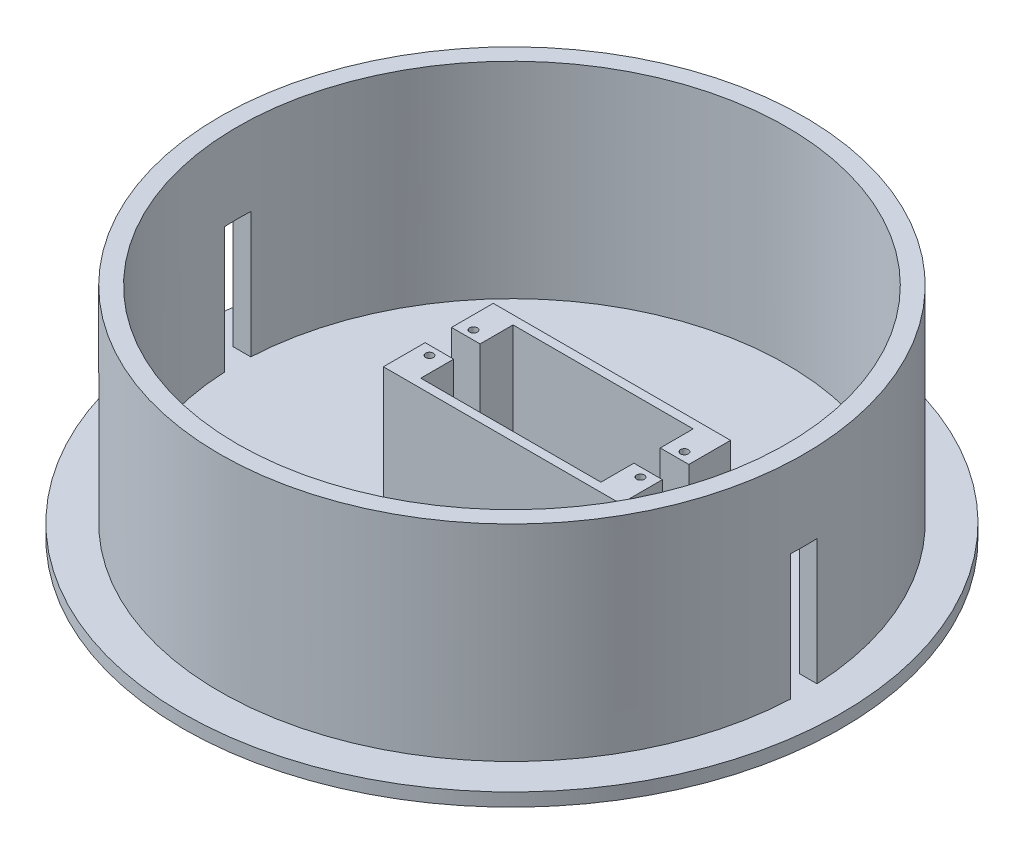
ISO-10303-21;
HEADER;
FILE_DESCRIPTION(('STEP AP214'),'2;1');
FILE_NAME('part.step','',(''),(''),'','','');
FILE_SCHEMA(('AUTOMOTIVE_DESIGN { 1 0 10303 214 1 1 1 1 }'));
ENDSEC;
DATA;
#1=APPLICATION_CONTEXT('core data for automotive mechanical design processes');
#2=APPLICATION_PROTOCOL_DEFINITION('international standard','automotive_design',2000,#1);
#3=PRODUCT_CONTEXT('',#1,'mechanical');
#4=PRODUCT('Part','Part','',(#3));
#5=PRODUCT_RELATED_PRODUCT_CATEGORY('part','',(#4));
#6=PRODUCT_DEFINITION_FORMATION('','',#4);
#7=PRODUCT_DEFINITION_CONTEXT('part definition',#1,'design');
#8=PRODUCT_DEFINITION('design','',#6,#7);
#9=PRODUCT_DEFINITION_SHAPE('','',#8);
#10=(LENGTH_UNIT() NAMED_UNIT(*) SI_UNIT(.MILLI.,.METRE.));
#11=(NAMED_UNIT(*) PLANE_ANGLE_UNIT() SI_UNIT($,.RADIAN.));
#12=(NAMED_UNIT(*) SI_UNIT($,.STERADIAN.) SOLID_ANGLE_UNIT());
#13=UNCERTAINTY_MEASURE_WITH_UNIT(LENGTH_MEASURE(1.E-05),#10,'distance_accuracy_value','');
#14=(GEOMETRIC_REPRESENTATION_CONTEXT(3) GLOBAL_UNCERTAINTY_ASSIGNED_CONTEXT((#13)) GLOBAL_UNIT_ASSIGNED_CONTEXT((#10,
#11,#12)) REPRESENTATION_CONTEXT('',''));
#15=CARTESIAN_POINT('',(0.,0.,0.));
#16=DIRECTION('',(0.,0.,1.));
#17=DIRECTION('',(1.,0.,0.));
#18=AXIS2_PLACEMENT_3D('',#15,#16,#17);
#19=CARTESIAN_POINT('',(-16.75,28.65,0.));
#20=DIRECTION('',(1.,0.,0.));
#21=DIRECTION('',(0.,0.,-1.));
#22=AXIS2_PLACEMENT_3D('',#19,#20,#21);
#23=PLANE('',#22);
#24=DIRECTION('',(0.,-1.,0.));
#25=VECTOR('',#24,1.);
#26=CARTESIAN_POINT('',(-16.75,28.65,-3.));
#27=LINE('',#26,#25);
#28=CARTESIAN_POINT('',(-16.75,28.65,-3.));
#29=VERTEX_POINT('',#28);
#30=CARTESIAN_POINT('',(-16.75,0.,-3.));
#31=VERTEX_POINT('',#30);
#32=EDGE_CURVE('E238',#29,#31,#27,.T.);
#33=ORIENTED_EDGE('',*,*,#32,.F.);
#34=DIRECTION('',(0.,0.,1.));
#35=VECTOR('',#34,1.);
#36=CARTESIAN_POINT('',(-16.75,28.65,0.));
#37=LINE('',#36,#35);
#38=CARTESIAN_POINT('',(-16.75,28.65,-12.5));
#39=VERTEX_POINT('',#38);
#40=EDGE_CURVE('E295',#39,#29,#37,.T.);
#41=ORIENTED_EDGE('',*,*,#40,.F.);
#42=DIRECTION('',(0.,-1.,0.));
#43=VECTOR('',#42,1.);
#44=CARTESIAN_POINT('',(-16.75,28.65,-12.5));
#45=LINE('',#44,#43);
#46=CARTESIAN_POINT('',(-16.75,0.,-12.5));
#47=VERTEX_POINT('',#46);
#48=EDGE_CURVE('E342',#39,#47,#45,.T.);
#49=ORIENTED_EDGE('',*,*,#48,.T.);
#50=DIRECTION('',(0.,0.,1.));
#51=VECTOR('',#50,1.);
#52=CARTESIAN_POINT('',(-16.75,0.,0.));
#53=LINE('',#52,#51);
#54=EDGE_CURVE('E323',#47,#31,#53,.T.);
#55=ORIENTED_EDGE('',*,*,#54,.T.);
#56=EDGE_LOOP('',(#33,#41,#49,#55));
#57=FACE_BOUND('',#56,.T.);
#58=ADVANCED_FACE('F41',(#57),#23,.F.);
#59=CARTESIAN_POINT('',(30.75,28.65,0.));
#60=DIRECTION('',(1.,0.,0.));
#61=DIRECTION('',(0.,0.,-1.));
#62=AXIS2_PLACEMENT_3D('',#59,#60,#61);
#63=PLANE('',#62);
#64=DIRECTION('',(0.,-1.,0.));
#65=VECTOR('',#64,1.);
#66=CARTESIAN_POINT('',(30.75,28.65,-3.00000000000001));
#67=LINE('',#66,#65);
#68=CARTESIAN_POINT('',(30.75,28.65,-3.00000000000001));
#69=VERTEX_POINT('',#68);
#70=CARTESIAN_POINT('',(30.75,0.,-3.));
#71=VERTEX_POINT('',#70);
#72=EDGE_CURVE('E450',#69,#71,#67,.T.);
#73=ORIENTED_EDGE('',*,*,#72,.F.);
#74=DIRECTION('',(0.,0.,1.));
#75=VECTOR('',#74,1.);
#76=CARTESIAN_POINT('',(30.75,28.65,0.));
#77=LINE('',#76,#75);
#78=CARTESIAN_POINT('',(30.75,28.65,-10.5));
#79=VERTEX_POINT('',#78);
#80=EDGE_CURVE('E269',#79,#69,#77,.T.);
#81=ORIENTED_EDGE('',*,*,#80,.F.);
#82=DIRECTION('',(0.,-1.,0.));
#83=VECTOR('',#82,1.);
#84=CARTESIAN_POINT('',(30.75,28.65,-10.5));
#85=LINE('',#84,#83);
#86=CARTESIAN_POINT('',(30.75,0.,-10.5));
#87=VERTEX_POINT('',#86);
#88=EDGE_CURVE('E336',#79,#87,#85,.T.);
#89=ORIENTED_EDGE('',*,*,#88,.T.);
#90=DIRECTION('',(0.,0.,1.));
#91=VECTOR('',#90,1.);
#92=CARTESIAN_POINT('',(30.75,0.,0.));
#93=LINE('',#92,#91);
#94=EDGE_CURVE('E309',#87,#71,#93,.T.);
#95=ORIENTED_EDGE('',*,*,#94,.T.);
#96=EDGE_LOOP('',(#73,#81,#89,#95));
#97=FACE_BOUND('',#96,.T.);
#98=ADVANCED_FACE('F400',(#97),#63,.F.);
#99=CARTESIAN_POINT('',(-10.25,28.65,0.));
#100=DIRECTION('',(1.,0.,0.));
#101=DIRECTION('',(0.,0.,-1.));
#102=AXIS2_PLACEMENT_3D('',#99,#100,#101);
#103=PLANE('',#102);
#104=DIRECTION('',(0.,0.,1.));
#105=VECTOR('',#104,1.);
#106=CARTESIAN_POINT('',(-10.25,28.65,0.));
#107=LINE('',#106,#105);
#108=CARTESIAN_POINT('',(-10.25,28.65,-10.5));
#109=VERTEX_POINT('',#108);
#110=CARTESIAN_POINT('',(-10.25,28.65,-3.));
#111=VERTEX_POINT('',#110);
#112=EDGE_CURVE('E276',#109,#111,#107,.T.);
#113=ORIENTED_EDGE('',*,*,#112,.T.);
#114=DIRECTION('',(0.,-1.,0.));
#115=VECTOR('',#114,1.);
#116=CARTESIAN_POINT('',(-10.25,28.65,-3.));
#117=LINE('',#116,#115);
#118=CARTESIAN_POINT('',(-10.25,0.,-3.));
#119=VERTEX_POINT('',#118);
#120=EDGE_CURVE('E447',#111,#119,#117,.T.);
#121=ORIENTED_EDGE('',*,*,#120,.T.);
#122=DIRECTION('',(0.,0.,1.));
#123=VECTOR('',#122,1.);
#124=CARTESIAN_POINT('',(-10.25,0.,0.));
#125=LINE('',#124,#123);
#126=CARTESIAN_POINT('',(-10.25,0.,-10.5));
#127=VERTEX_POINT('',#126);
#128=EDGE_CURVE('E316',#127,#119,#125,.T.);
#129=ORIENTED_EDGE('',*,*,#128,.F.);
#130=DIRECTION('',(0.,-1.,0.));
#131=VECTOR('',#130,1.);
#132=CARTESIAN_POINT('',(-10.25,28.65,-10.5));
#133=LINE('',#132,#131);
#134=EDGE_CURVE('E305',#109,#127,#133,.T.);
#135=ORIENTED_EDGE('',*,*,#134,.F.);
#136=EDGE_LOOP('',(#113,#121,#129,#135));
#137=FACE_BOUND('',#136,.T.);
#138=ADVANCED_FACE('F407',(#137),#103,.T.);
#139=CARTESIAN_POINT('',(37.25,28.65,0.));
#140=DIRECTION('',(1.,0.,0.));
#141=DIRECTION('',(0.,0.,-1.));
#142=AXIS2_PLACEMENT_3D('',#139,#140,#141);
#143=PLANE('',#142);
#144=DIRECTION('',(0.,0.,1.));
#145=VECTOR('',#144,1.);
#146=CARTESIAN_POINT('',(37.25,28.65,0.));
#147=LINE('',#146,#145);
#148=CARTESIAN_POINT('',(37.25,28.65,-12.5));
#149=VERTEX_POINT('',#148);
#150=CARTESIAN_POINT('',(37.25,28.65,-3.));
#151=VERTEX_POINT('',#150);
#152=EDGE_CURVE('E302',#149,#151,#147,.T.);
#153=ORIENTED_EDGE('',*,*,#152,.T.);
#154=DIRECTION('',(0.,-1.,0.));
#155=VECTOR('',#154,1.);
#156=CARTESIAN_POINT('',(37.25,28.65,-3.00000000000001));
#157=LINE('',#156,#155);
#158=CARTESIAN_POINT('',(37.25,0.,-3.00000000000001));
#159=VERTEX_POINT('',#158);
#160=EDGE_CURVE('E441',#151,#159,#157,.T.);
#161=ORIENTED_EDGE('',*,*,#160,.T.);
#162=DIRECTION('',(0.,0.,1.));
#163=VECTOR('',#162,1.);
#164=CARTESIAN_POINT('',(37.25,0.,0.));
#165=LINE('',#164,#163);
#166=CARTESIAN_POINT('',(37.25,0.,-12.5));
#167=VERTEX_POINT('',#166);
#168=EDGE_CURVE('E268',#167,#159,#165,.T.);
#169=ORIENTED_EDGE('',*,*,#168,.F.);
#170=DIRECTION('',(0.,-1.,0.));
#171=VECTOR('',#170,1.);
#172=CARTESIAN_POINT('',(37.25,28.65,-12.5));
#173=LINE('',#172,#171);
#174=EDGE_CURVE('E332',#149,#167,#173,.T.);
#175=ORIENTED_EDGE('',*,*,#174,.F.);
#176=EDGE_LOOP('',(#153,#161,#169,#175));
#177=FACE_BOUND('',#176,.T.);
#178=ADVANCED_FACE('F465',(#177),#143,.T.);
#179=CARTESIAN_POINT('',(0.,28.65,0.));
#180=DIRECTION('',(0.,1.,0.));
#181=DIRECTION('',(0.,0.,1.));
#182=AXIS2_PLACEMENT_3D('',#179,#180,#181);
#183=PLANE('',#182);
#184=CARTESIAN_POINT('',(34.25,28.65,-5.));
#185=DIRECTION('',(0.,1.,0.));
#186=DIRECTION('',(0.,0.,1.));
#187=AXIS2_PLACEMENT_3D('',#184,#185,#186);
#188=CIRCLE('',#187,0.874999999999998);
#189=CARTESIAN_POINT('',(34.25,28.65,-4.125));
#190=VERTEX_POINT('',#189);
#191=EDGE_CURVE('E288',#190,#190,#188,.T.);
#192=ORIENTED_EDGE('',*,*,#191,.F.);
#193=EDGE_LOOP('',(#192));
#194=FACE_BOUND('',#193,.T.);
#195=CARTESIAN_POINT('',(-13.75,28.65,-4.99999999999999));
#196=DIRECTION('',(0.,1.,0.));
#197=DIRECTION('',(0.,0.,1.));
#198=AXIS2_PLACEMENT_3D('',#195,#196,#197);
#199=CIRCLE('',#198,0.875000000000002);
#200=CARTESIAN_POINT('',(-13.75,28.65,-4.12499999999999));
#201=VERTEX_POINT('',#200);
#202=EDGE_CURVE('E285',#201,#201,#199,.T.);
#203=ORIENTED_EDGE('',*,*,#202,.F.);
#204=EDGE_LOOP('',(#203));
#205=FACE_BOUND('',#204,.T.);
#206=ORIENTED_EDGE('',*,*,#40,.T.);
#207=DIRECTION('',(1.,0.,0.));
#208=VECTOR('',#207,1.);
#209=CARTESIAN_POINT('',(-75.,28.65,-2.99999999999999));
#210=LINE('',#209,#208);
#211=EDGE_CURVE('E226',#29,#111,#210,.T.);
#212=ORIENTED_EDGE('',*,*,#211,.T.);
#213=ORIENTED_EDGE('',*,*,#112,.F.);
#214=DIRECTION('',(-1.,0.,0.));
#215=VECTOR('',#214,1.);
#216=CARTESIAN_POINT('',(0.,28.65,-10.5));
#217=LINE('',#216,#215);
#218=EDGE_CURVE('E264',#79,#109,#217,.T.);
#219=ORIENTED_EDGE('',*,*,#218,.F.);
#220=ORIENTED_EDGE('',*,*,#80,.T.);
#221=EDGE_CURVE('E470',#69,#151,#210,.T.);
#222=ORIENTED_EDGE('',*,*,#221,.T.);
#223=ORIENTED_EDGE('',*,*,#152,.F.);
#224=DIRECTION('',(-1.,0.,0.));
#225=VECTOR('',#224,1.);
#226=CARTESIAN_POINT('',(0.,28.65,-12.5));
#227=LINE('',#226,#225);
#228=EDGE_CURVE('E291',#149,#39,#227,.T.);
#229=ORIENTED_EDGE('',*,*,#228,.T.);
#230=EDGE_LOOP('',(#206,#212,#213,#219,#220,#222,#223,#229));
#231=FACE_BOUND('',#230,.T.);
#232=ADVANCED_FACE('F473',(#194,#205,#231),#183,.T.);
#233=CARTESIAN_POINT('',(0.,46.8,0.));
#234=DIRECTION('',(0.,-1.,0.));
#235=DIRECTION('',(0.,0.,-1.));
#236=AXIS2_PLACEMENT_3D('',#233,#234,#235);
#237=CYLINDRICAL_SURFACE('',#236,62.5);
#238=DIRECTION('',(0.,-1.,0.));
#239=VECTOR('',#238,1.);
#240=CARTESIAN_POINT('',(-62.4279584801554,46.8,3.));
#241=LINE('',#240,#239);
#242=CARTESIAN_POINT('',(-62.4279584801554,28.65,3.00000000000001));
#243=VERTEX_POINT('',#242);
#244=CARTESIAN_POINT('',(-62.4279584801554,0.,3.00000000000001));
#245=VERTEX_POINT('',#244);
#246=EDGE_CURVE('E216',#243,#245,#241,.T.);
#247=ORIENTED_EDGE('',*,*,#246,.F.);
#248=CARTESIAN_POINT('',(0.,28.65,0.));
#249=DIRECTION('',(0.,-1.,0.));
#250=DIRECTION('',(0.,0.,-1.));
#251=AXIS2_PLACEMENT_3D('',#248,#249,#250);
#252=CIRCLE('',#251,62.5);
#253=CARTESIAN_POINT('',(-62.4279584801554,28.65,-2.99999999999999));
#254=VERTEX_POINT('',#253);
#255=EDGE_CURVE('E261',#243,#254,#252,.T.);
#256=ORIENTED_EDGE('',*,*,#255,.T.);
#257=DIRECTION('',(0.,-1.,0.));
#258=VECTOR('',#257,1.);
#259=CARTESIAN_POINT('',(-62.4279584801554,46.8,-3.));
#260=LINE('',#259,#258);
#261=CARTESIAN_POINT('',(-62.4279584801554,0.,-2.99999999999999));
#262=VERTEX_POINT('',#261);
#263=EDGE_CURVE('E224',#254,#262,#260,.T.);
#264=ORIENTED_EDGE('',*,*,#263,.T.);
#265=CARTESIAN_POINT('',(0.,0.,0.));
#266=DIRECTION('',(0.,1.,0.));
#267=DIRECTION('',(0.,0.,1.));
#268=AXIS2_PLACEMENT_3D('',#265,#266,#267);
#269=CIRCLE('',#268,62.5);
#270=CARTESIAN_POINT('',(62.4279584801554,0.,-3.00000000000001));
#271=VERTEX_POINT('',#270);
#272=EDGE_CURVE('E369',#271,#262,#269,.T.);
#273=ORIENTED_EDGE('',*,*,#272,.F.);
#274=DIRECTION('',(0.,-1.,0.));
#275=VECTOR('',#274,1.);
#276=CARTESIAN_POINT('',(62.4279584801554,46.8,-3.00000000000001));
#277=LINE('',#276,#275);
#278=CARTESIAN_POINT('',(62.4279584801554,28.65,-3.00000000000001));
#279=VERTEX_POINT('',#278);
#280=EDGE_CURVE('E233',#271,#279,#277,.F.);
#281=ORIENTED_EDGE('',*,*,#280,.T.);
#282=CARTESIAN_POINT('',(62.4279584801554,28.65,2.99999999999999));
#283=VERTEX_POINT('',#282);
#284=EDGE_CURVE('E263',#279,#283,#252,.T.);
#285=ORIENTED_EDGE('',*,*,#284,.T.);
#286=DIRECTION('',(0.,-1.,0.));
#287=VECTOR('',#286,1.);
#288=CARTESIAN_POINT('',(62.4279584801554,46.8,2.99999999999999));
#289=LINE('',#288,#287);
#290=CARTESIAN_POINT('',(62.4279584801554,0.,2.99999999999999));
#291=VERTEX_POINT('',#290);
#292=EDGE_CURVE('E258',#291,#283,#289,.F.);
#293=ORIENTED_EDGE('',*,*,#292,.F.);
#294=EDGE_CURVE('E359',#245,#291,#269,.T.);
#295=ORIENTED_EDGE('',*,*,#294,.F.);
#296=EDGE_LOOP('',(#247,#256,#264,#273,#281,#285,#293,#295));
#297=FACE_BOUND('',#296,.T.);
#298=CARTESIAN_POINT('',(0.,46.8,0.));
#299=DIRECTION('',(0.,1.,0.));
#300=DIRECTION('',(0.,0.,1.));
#301=AXIS2_PLACEMENT_3D('',#298,#299,#300);
#302=CIRCLE('',#301,62.5);
#303=CARTESIAN_POINT('',(0.,46.8,62.5));
#304=VERTEX_POINT('',#303);
#305=EDGE_CURVE('E365',#304,#304,#302,.T.);
#306=ORIENTED_EDGE('',*,*,#305,.T.);
#307=EDGE_LOOP('',(#306));
#308=FACE_BOUND('',#307,.T.);
#309=ADVANCED_FACE('F43',(#297,#308),#237,.F.);
#310=CARTESIAN_POINT('',(0.,46.8,0.));
#311=DIRECTION('',(0.,-1.,0.));
#312=DIRECTION('',(0.,0.,-1.));
#313=AXIS2_PLACEMENT_3D('',#310,#311,#312);
#314=CYLINDRICAL_SURFACE('',#313,66.5);
#315=CARTESIAN_POINT('',(0.,28.65,0.));
#316=DIRECTION('',(0.,-1.,0.));
#317=DIRECTION('',(0.,0.,-1.));
#318=AXIS2_PLACEMENT_3D('',#315,#316,#317);
#319=CIRCLE('',#318,66.5);
#320=CARTESIAN_POINT('',(-66.4322963625374,28.65,3.00000000000001));
#321=VERTEX_POINT('',#320);
#322=CARTESIAN_POINT('',(-66.4322963625374,28.65,-2.99999999999999));
#323=VERTEX_POINT('',#322);
#324=EDGE_CURVE('E205',#321,#323,#319,.T.);
#325=ORIENTED_EDGE('',*,*,#324,.F.);
#326=DIRECTION('',(0.,-1.,0.));
#327=VECTOR('',#326,1.);
#328=CARTESIAN_POINT('',(-66.4322963625374,46.8,3.));
#329=LINE('',#328,#327);
#330=CARTESIAN_POINT('',(-66.4322963625374,0.,3.00000000000001));
#331=VERTEX_POINT('',#330);
#332=EDGE_CURVE('E256',#321,#331,#329,.T.);
#333=ORIENTED_EDGE('',*,*,#332,.T.);
#334=CARTESIAN_POINT('',(0.,0.,0.));
#335=DIRECTION('',(0.,1.,0.));
#336=DIRECTION('',(0.,0.,1.));
#337=AXIS2_PLACEMENT_3D('',#334,#335,#336);
#338=CIRCLE('',#337,66.5);
#339=CARTESIAN_POINT('',(66.4322963625374,0.,2.99999999999999));
#340=VERTEX_POINT('',#339);
#341=EDGE_CURVE('E345',#331,#340,#338,.T.);
#342=ORIENTED_EDGE('',*,*,#341,.T.);
#343=DIRECTION('',(0.,-1.,0.));
#344=VECTOR('',#343,1.);
#345=CARTESIAN_POINT('',(66.4322963625374,46.8,2.99999999999999));
#346=LINE('',#345,#344);
#347=CARTESIAN_POINT('',(66.4322963625374,28.65,2.99999999999999));
#348=VERTEX_POINT('',#347);
#349=EDGE_CURVE('E253',#340,#348,#346,.F.);
#350=ORIENTED_EDGE('',*,*,#349,.T.);
#351=CARTESIAN_POINT('',(66.4322963625374,28.65,-3.00000000000001));
#352=VERTEX_POINT('',#351);
#353=EDGE_CURVE('E215',#352,#348,#319,.T.);
#354=ORIENTED_EDGE('',*,*,#353,.F.);
#355=DIRECTION('',(0.,-1.,0.));
#356=VECTOR('',#355,1.);
#357=CARTESIAN_POINT('',(66.4322963625374,46.8,-3.00000000000001));
#358=LINE('',#357,#356);
#359=CARTESIAN_POINT('',(66.4322963625374,0.,-3.00000000000001));
#360=VERTEX_POINT('',#359);
#361=EDGE_CURVE('E234',#360,#352,#358,.F.);
#362=ORIENTED_EDGE('',*,*,#361,.F.);
#363=CARTESIAN_POINT('',(-66.4322963625374,0.,-2.99999999999999));
#364=VERTEX_POINT('',#363);
#365=EDGE_CURVE('E232',#360,#364,#338,.T.);
#366=ORIENTED_EDGE('',*,*,#365,.T.);
#367=DIRECTION('',(0.,-1.,0.));
#368=VECTOR('',#367,1.);
#369=CARTESIAN_POINT('',(-66.4322963625374,46.8,-3.));
#370=LINE('',#369,#368);
#371=EDGE_CURVE('E221',#323,#364,#370,.T.);
#372=ORIENTED_EDGE('',*,*,#371,.F.);
#373=EDGE_LOOP('',(#325,#333,#342,#350,#354,#362,#366,#372));
#374=FACE_BOUND('',#373,.T.);
#375=CARTESIAN_POINT('',(0.,46.8,0.));
#376=DIRECTION('',(0.,1.,0.));
#377=DIRECTION('',(0.,0.,1.));
#378=AXIS2_PLACEMENT_3D('',#375,#376,#377);
#379=CIRCLE('',#378,66.5);
#380=CARTESIAN_POINT('',(0.,46.8,66.5));
#381=VERTEX_POINT('',#380);
#382=EDGE_CURVE('E368',#381,#381,#379,.T.);
#383=ORIENTED_EDGE('',*,*,#382,.F.);
#384=EDGE_LOOP('',(#383));
#385=FACE_BOUND('',#384,.T.);
#386=ADVANCED_FACE('F229',(#374,#385),#314,.T.);
#387=CARTESIAN_POINT('',(0.,46.8,0.));
#388=DIRECTION('',(0.,1.,0.));
#389=DIRECTION('',(0.,0.,1.));
#390=AXIS2_PLACEMENT_3D('',#387,#388,#389);
#391=PLANE('',#390);
#392=ORIENTED_EDGE('',*,*,#305,.F.);
#393=EDGE_LOOP('',(#392));
#394=FACE_BOUND('',#393,.T.);
#395=ORIENTED_EDGE('',*,*,#382,.T.);
#396=EDGE_LOOP('',(#395));
#397=FACE_BOUND('',#396,.T.);
#398=ADVANCED_FACE('F548',(#394,#397),#391,.T.);
#399=CARTESIAN_POINT('',(0.,-3.,0.));
#400=DIRECTION('',(0.,1.,0.));
#401=DIRECTION('',(0.,0.,1.));
#402=AXIS2_PLACEMENT_3D('',#399,#400,#401);
#403=CYLINDRICAL_SURFACE('',#402,75.);
#404=CARTESIAN_POINT('',(0.,-3.,0.));
#405=DIRECTION('',(0.,1.,0.));
#406=DIRECTION('',(0.,0.,1.));
#407=AXIS2_PLACEMENT_3D('',#404,#405,#406);
#408=CIRCLE('',#407,75.);
#409=CARTESIAN_POINT('',(0.,-3.,75.));
#410=VERTEX_POINT('',#409);
#411=EDGE_CURVE('E356',#410,#410,#408,.T.);
#412=ORIENTED_EDGE('',*,*,#411,.T.);
#413=EDGE_LOOP('',(#412));
#414=FACE_BOUND('',#413,.T.);
#415=CARTESIAN_POINT('',(0.,0.,0.));
#416=DIRECTION('',(0.,1.,0.));
#417=DIRECTION('',(0.,0.,1.));
#418=AXIS2_PLACEMENT_3D('',#415,#416,#417);
#419=CIRCLE('',#418,75.);
#420=CARTESIAN_POINT('',(0.,0.,75.));
#421=VERTEX_POINT('',#420);
#422=EDGE_CURVE('E360',#421,#421,#419,.T.);
#423=ORIENTED_EDGE('',*,*,#422,.F.);
#424=EDGE_LOOP('',(#423));
#425=FACE_BOUND('',#424,.T.);
#426=ADVANCED_FACE('F546',(#414,#425),#403,.T.);
#427=CARTESIAN_POINT('',(0.,-3.,0.));
#428=DIRECTION('',(0.,1.,0.));
#429=DIRECTION('',(0.,0.,1.));
#430=AXIS2_PLACEMENT_3D('',#427,#428,#429);
#431=PLANE('',#430);
#432=ORIENTED_EDGE('',*,*,#411,.F.);
#433=EDGE_LOOP('',(#432));
#434=FACE_BOUND('',#433,.T.);
#435=ADVANCED_FACE('F424',(#434),#431,.F.);
#436=CARTESIAN_POINT('',(0.,28.65,-12.5));
#437=DIRECTION('',(0.,0.,1.));
#438=DIRECTION('',(1.,0.,0.));
#439=AXIS2_PLACEMENT_3D('',#436,#437,#438);
#440=PLANE('',#439);
#441=DIRECTION('',(-1.,0.,0.));
#442=VECTOR('',#441,1.);
#443=CARTESIAN_POINT('',(0.,0.,-12.5));
#444=LINE('',#443,#442);
#445=EDGE_CURVE('E319',#167,#47,#444,.T.);
#446=ORIENTED_EDGE('',*,*,#445,.T.);
#447=ORIENTED_EDGE('',*,*,#48,.F.);
#448=ORIENTED_EDGE('',*,*,#228,.F.);
#449=ORIENTED_EDGE('',*,*,#174,.T.);
#450=EDGE_LOOP('',(#446,#447,#448,#449));
#451=FACE_BOUND('',#450,.T.);
#452=ADVANCED_FACE('F416',(#451),#440,.F.);
#453=CARTESIAN_POINT('',(-16.75,28.65,3.));
#454=VERTEX_POINT('',#453);
#455=CARTESIAN_POINT('',(-16.75,28.65,12.5));
#456=VERTEX_POINT('',#455);
#457=EDGE_CURVE('E294',#454,#456,#37,.T.);
#458=ORIENTED_EDGE('',*,*,#457,.F.);
#459=DIRECTION('',(0.,-1.,0.));
#460=VECTOR('',#459,1.);
#461=CARTESIAN_POINT('',(-16.75,28.65,3.));
#462=LINE('',#461,#460);
#463=CARTESIAN_POINT('',(-16.75,0.,3.));
#464=VERTEX_POINT('',#463);
#465=EDGE_CURVE('E250',#454,#464,#462,.T.);
#466=ORIENTED_EDGE('',*,*,#465,.T.);
#467=CARTESIAN_POINT('',(-16.75,0.,12.5));
#468=VERTEX_POINT('',#467);
#469=EDGE_CURVE('E322',#464,#468,#53,.T.);
#470=ORIENTED_EDGE('',*,*,#469,.T.);
#471=DIRECTION('',(0.,-1.,0.));
#472=VECTOR('',#471,1.);
#473=CARTESIAN_POINT('',(-16.75,28.65,12.5));
#474=LINE('',#473,#472);
#475=EDGE_CURVE('E339',#456,#468,#474,.T.);
#476=ORIENTED_EDGE('',*,*,#475,.F.);
#477=EDGE_LOOP('',(#458,#466,#470,#476));
#478=FACE_BOUND('',#477,.T.);
#479=ADVANCED_FACE('F403',(#478),#23,.F.);
#480=CARTESIAN_POINT('',(0.,28.65,12.5));
#481=DIRECTION('',(0.,0.,1.));
#482=DIRECTION('',(1.,0.,0.));
#483=AXIS2_PLACEMENT_3D('',#480,#481,#482);
#484=PLANE('',#483);
#485=DIRECTION('',(-1.,0.,0.));
#486=VECTOR('',#485,1.);
#487=CARTESIAN_POINT('',(0.,0.,12.5));
#488=LINE('',#487,#486);
#489=CARTESIAN_POINT('',(37.25,0.,12.5));
#490=VERTEX_POINT('',#489);
#491=EDGE_CURVE('E326',#490,#468,#488,.T.);
#492=ORIENTED_EDGE('',*,*,#491,.F.);
#493=DIRECTION('',(0.,-1.,0.));
#494=VECTOR('',#493,1.);
#495=CARTESIAN_POINT('',(37.25,28.65,12.5));
#496=LINE('',#495,#494);
#497=CARTESIAN_POINT('',(37.25,28.65,12.5));
#498=VERTEX_POINT('',#497);
#499=EDGE_CURVE('E335',#498,#490,#496,.T.);
#500=ORIENTED_EDGE('',*,*,#499,.F.);
#501=DIRECTION('',(-1.,0.,0.));
#502=VECTOR('',#501,1.);
#503=CARTESIAN_POINT('',(0.,28.65,12.5));
#504=LINE('',#503,#502);
#505=EDGE_CURVE('E298',#498,#456,#504,.T.);
#506=ORIENTED_EDGE('',*,*,#505,.T.);
#507=ORIENTED_EDGE('',*,*,#475,.T.);
#508=EDGE_LOOP('',(#492,#500,#506,#507));
#509=FACE_BOUND('',#508,.T.);
#510=ADVANCED_FACE('F415',(#509),#484,.T.);
#511=CARTESIAN_POINT('',(0.,28.65,-10.5));
#512=DIRECTION('',(0.,0.,1.));
#513=DIRECTION('',(1.,0.,0.));
#514=AXIS2_PLACEMENT_3D('',#511,#512,#513);
#515=PLANE('',#514);
#516=DIRECTION('',(-1.,0.,0.));
#517=VECTOR('',#516,1.);
#518=CARTESIAN_POINT('',(0.,0.,-10.5));
#519=LINE('',#518,#517);
#520=EDGE_CURVE('E306',#87,#127,#519,.T.);
#521=ORIENTED_EDGE('',*,*,#520,.F.);
#522=ORIENTED_EDGE('',*,*,#88,.F.);
#523=ORIENTED_EDGE('',*,*,#218,.T.);
#524=ORIENTED_EDGE('',*,*,#134,.T.);
#525=EDGE_LOOP('',(#521,#522,#523,#524));
#526=FACE_BOUND('',#525,.T.);
#527=ADVANCED_FACE('F422',(#526),#515,.T.);
#528=CARTESIAN_POINT('',(30.75,28.65,2.99999999999999));
#529=VERTEX_POINT('',#528);
#530=CARTESIAN_POINT('',(30.75,28.65,10.5));
#531=VERTEX_POINT('',#530);
#532=EDGE_CURVE('E267',#529,#531,#77,.T.);
#533=ORIENTED_EDGE('',*,*,#532,.F.);
#534=DIRECTION('',(0.,-1.,0.));
#535=VECTOR('',#534,1.);
#536=CARTESIAN_POINT('',(30.75,28.65,2.99999999999999));
#537=LINE('',#536,#535);
#538=CARTESIAN_POINT('',(30.75,0.,3.));
#539=VERTEX_POINT('',#538);
#540=EDGE_CURVE('E247',#529,#539,#537,.T.);
#541=ORIENTED_EDGE('',*,*,#540,.T.);
#542=CARTESIAN_POINT('',(30.75,0.,10.5));
#543=VERTEX_POINT('',#542);
#544=EDGE_CURVE('E308',#539,#543,#93,.T.);
#545=ORIENTED_EDGE('',*,*,#544,.T.);
#546=DIRECTION('',(0.,-1.,0.));
#547=VECTOR('',#546,1.);
#548=CARTESIAN_POINT('',(30.75,28.65,10.5));
#549=LINE('',#548,#547);
#550=EDGE_CURVE('E351',#531,#543,#549,.T.);
#551=ORIENTED_EDGE('',*,*,#550,.F.);
#552=EDGE_LOOP('',(#533,#541,#545,#551));
#553=FACE_BOUND('',#552,.T.);
#554=ADVANCED_FACE('F410',(#553),#63,.F.);
#555=CARTESIAN_POINT('',(0.,28.65,10.5));
#556=DIRECTION('',(0.,0.,1.));
#557=DIRECTION('',(1.,0.,0.));
#558=AXIS2_PLACEMENT_3D('',#555,#556,#557);
#559=PLANE('',#558);
#560=DIRECTION('',(-1.,0.,0.));
#561=VECTOR('',#560,1.);
#562=CARTESIAN_POINT('',(0.,0.,10.5));
#563=LINE('',#562,#561);
#564=CARTESIAN_POINT('',(-10.25,0.,10.5));
#565=VERTEX_POINT('',#564);
#566=EDGE_CURVE('E312',#543,#565,#563,.T.);
#567=ORIENTED_EDGE('',*,*,#566,.T.);
#568=DIRECTION('',(0.,-1.,0.));
#569=VECTOR('',#568,1.);
#570=CARTESIAN_POINT('',(-10.25,28.65,10.5));
#571=LINE('',#570,#569);
#572=CARTESIAN_POINT('',(-10.25,28.65,10.5));
#573=VERTEX_POINT('',#572);
#574=EDGE_CURVE('E348',#573,#565,#571,.T.);
#575=ORIENTED_EDGE('',*,*,#574,.F.);
#576=DIRECTION('',(-1.,0.,0.));
#577=VECTOR('',#576,1.);
#578=CARTESIAN_POINT('',(0.,28.65,10.5));
#579=LINE('',#578,#577);
#580=EDGE_CURVE('E272',#531,#573,#579,.T.);
#581=ORIENTED_EDGE('',*,*,#580,.F.);
#582=ORIENTED_EDGE('',*,*,#550,.T.);
#583=EDGE_LOOP('',(#567,#575,#581,#582));
#584=FACE_BOUND('',#583,.T.);
#585=ADVANCED_FACE('F504',(#584),#559,.F.);
#586=CARTESIAN_POINT('',(34.25,28.65,-5.));
#587=DIRECTION('',(0.,-1.,0.));
#588=DIRECTION('',(0.,0.,-1.));
#589=AXIS2_PLACEMENT_3D('',#586,#587,#588);
#590=CYLINDRICAL_SURFACE('',#589,0.874999999999998);
#591=ORIENTED_EDGE('',*,*,#191,.T.);
#592=EDGE_LOOP('',(#591));
#593=FACE_BOUND('',#592,.T.);
#594=CARTESIAN_POINT('',(34.25,0.,-5.));
#595=DIRECTION('',(0.,1.,0.));
#596=DIRECTION('',(0.,0.,1.));
#597=AXIS2_PLACEMENT_3D('',#594,#595,#596);
#598=CIRCLE('',#597,0.874999999999998);
#599=CARTESIAN_POINT('',(34.25,0.,-4.125));
#600=VERTEX_POINT('',#599);
#601=EDGE_CURVE('E11',#600,#600,#598,.F.);
#602=ORIENTED_EDGE('',*,*,#601,.T.);
#603=EDGE_LOOP('',(#602));
#604=FACE_BOUND('',#603,.T.);
#605=ADVANCED_FACE('F564',(#593,#604),#590,.F.);
#606=CARTESIAN_POINT('',(-13.75,28.65,-4.99999999999999));
#607=DIRECTION('',(0.,-1.,0.));
#608=DIRECTION('',(0.,0.,-1.));
#609=AXIS2_PLACEMENT_3D('',#606,#607,#608);
#610=CYLINDRICAL_SURFACE('',#609,0.875000000000002);
#611=ORIENTED_EDGE('',*,*,#202,.T.);
#612=EDGE_LOOP('',(#611));
#613=FACE_BOUND('',#612,.T.);
#614=CARTESIAN_POINT('',(-13.75,0.,-4.99999999999999));
#615=DIRECTION('',(0.,1.,0.));
#616=DIRECTION('',(0.,0.,1.));
#617=AXIS2_PLACEMENT_3D('',#614,#615,#616);
#618=CIRCLE('',#617,0.875000000000002);
#619=CARTESIAN_POINT('',(-13.75,0.,-4.12499999999999));
#620=VERTEX_POINT('',#619);
#621=EDGE_CURVE('E49',#620,#620,#618,.F.);
#622=ORIENTED_EDGE('',*,*,#621,.T.);
#623=EDGE_LOOP('',(#622));
#624=FACE_BOUND('',#623,.T.);
#625=ADVANCED_FACE('F381',(#613,#624),#610,.F.);
#626=CARTESIAN_POINT('',(34.25,28.65,5.));
#627=DIRECTION('',(0.,-1.,0.));
#628=DIRECTION('',(0.,0.,-1.));
#629=AXIS2_PLACEMENT_3D('',#626,#627,#628);
#630=CYLINDRICAL_SURFACE('',#629,0.874999999999998);
#631=CARTESIAN_POINT('',(34.25,28.65,5.));
#632=DIRECTION('',(0.,1.,0.));
#633=DIRECTION('',(0.,0.,1.));
#634=AXIS2_PLACEMENT_3D('',#631,#632,#633);
#635=CIRCLE('',#634,0.874999999999998);
#636=CARTESIAN_POINT('',(34.25,28.65,5.875));
#637=VERTEX_POINT('',#636);
#638=EDGE_CURVE('E282',#637,#637,#635,.T.);
#639=ORIENTED_EDGE('',*,*,#638,.T.);
#640=EDGE_LOOP('',(#639));
#641=FACE_BOUND('',#640,.T.);
#642=CARTESIAN_POINT('',(34.25,0.,5.));
#643=DIRECTION('',(0.,1.,0.));
#644=DIRECTION('',(0.,0.,1.));
#645=AXIS2_PLACEMENT_3D('',#642,#643,#644);
#646=CIRCLE('',#645,0.874999999999998);
#647=CARTESIAN_POINT('',(34.25,0.,5.875));
#648=VERTEX_POINT('',#647);
#649=EDGE_CURVE('E376',#648,#648,#646,.F.);
#650=ORIENTED_EDGE('',*,*,#649,.T.);
#651=EDGE_LOOP('',(#650));
#652=FACE_BOUND('',#651,.T.);
#653=ADVANCED_FACE('F570',(#641,#652),#630,.F.);
#654=CARTESIAN_POINT('',(-13.75,28.65,4.99999999999999));
#655=DIRECTION('',(0.,-1.,0.));
#656=DIRECTION('',(0.,0.,-1.));
#657=AXIS2_PLACEMENT_3D('',#654,#655,#656);
#658=CYLINDRICAL_SURFACE('',#657,0.875000000000002);
#659=CARTESIAN_POINT('',(-13.75,28.65,4.99999999999999));
#660=DIRECTION('',(0.,1.,0.));
#661=DIRECTION('',(0.,0.,1.));
#662=AXIS2_PLACEMENT_3D('',#659,#660,#661);
#663=CIRCLE('',#662,0.875000000000002);
#664=CARTESIAN_POINT('',(-13.75,28.65,5.875));
#665=VERTEX_POINT('',#664);
#666=EDGE_CURVE('E279',#665,#665,#663,.T.);
#667=ORIENTED_EDGE('',*,*,#666,.T.);
#668=EDGE_LOOP('',(#667));
#669=FACE_BOUND('',#668,.T.);
#670=CARTESIAN_POINT('',(-13.75,0.,4.99999999999999));
#671=DIRECTION('',(0.,1.,0.));
#672=DIRECTION('',(0.,0.,1.));
#673=AXIS2_PLACEMENT_3D('',#670,#671,#672);
#674=CIRCLE('',#673,0.875000000000002);
#675=CARTESIAN_POINT('',(-13.75,0.,5.875));
#676=VERTEX_POINT('',#675);
#677=EDGE_CURVE('E372',#676,#676,#674,.F.);
#678=ORIENTED_EDGE('',*,*,#677,.T.);
#679=EDGE_LOOP('',(#678));
#680=FACE_BOUND('',#679,.T.);
#681=ADVANCED_FACE('F567',(#669,#680),#658,.F.);
#682=DIRECTION('',(0.,-1.,0.));
#683=VECTOR('',#682,1.);
#684=CARTESIAN_POINT('',(-10.25,28.65,3.));
#685=LINE('',#684,#683);
#686=CARTESIAN_POINT('',(-10.25,28.65,3.));
#687=VERTEX_POINT('',#686);
#688=CARTESIAN_POINT('',(-10.25,0.,3.));
#689=VERTEX_POINT('',#688);
#690=EDGE_CURVE('E245',#687,#689,#685,.T.);
#691=ORIENTED_EDGE('',*,*,#690,.F.);
#692=EDGE_CURVE('E275',#687,#573,#107,.T.);
#693=ORIENTED_EDGE('',*,*,#692,.T.);
#694=ORIENTED_EDGE('',*,*,#574,.T.);
#695=EDGE_CURVE('E315',#689,#565,#125,.T.);
#696=ORIENTED_EDGE('',*,*,#695,.F.);
#697=EDGE_LOOP('',(#691,#693,#694,#696));
#698=FACE_BOUND('',#697,.T.);
#699=ADVANCED_FACE('F500',(#698),#103,.T.);
#700=DIRECTION('',(0.,-1.,0.));
#701=VECTOR('',#700,1.);
#702=CARTESIAN_POINT('',(37.25,28.65,2.99999999999999));
#703=LINE('',#702,#701);
#704=CARTESIAN_POINT('',(37.25,28.65,2.99999999999999));
#705=VERTEX_POINT('',#704);
#706=CARTESIAN_POINT('',(37.25,0.,2.99999999999999));
#707=VERTEX_POINT('',#706);
#708=EDGE_CURVE('E243',#705,#707,#703,.T.);
#709=ORIENTED_EDGE('',*,*,#708,.F.);
#710=EDGE_CURVE('E301',#705,#498,#147,.T.);
#711=ORIENTED_EDGE('',*,*,#710,.T.);
#712=ORIENTED_EDGE('',*,*,#499,.T.);
#713=EDGE_CURVE('E329',#707,#490,#165,.T.);
#714=ORIENTED_EDGE('',*,*,#713,.F.);
#715=EDGE_LOOP('',(#709,#711,#712,#714));
#716=FACE_BOUND('',#715,.T.);
#717=ADVANCED_FACE('F495',(#716),#143,.T.);
#718=DIRECTION('',(1.,0.,0.));
#719=VECTOR('',#718,1.);
#720=CARTESIAN_POINT('',(-75.,28.65,3.00000000000001));
#721=LINE('',#720,#719);
#722=EDGE_CURVE('E436',#454,#687,#721,.T.);
#723=ORIENTED_EDGE('',*,*,#722,.F.);
#724=ORIENTED_EDGE('',*,*,#457,.T.);
#725=ORIENTED_EDGE('',*,*,#505,.F.);
#726=ORIENTED_EDGE('',*,*,#710,.F.);
#727=EDGE_CURVE('E439',#529,#705,#721,.T.);
#728=ORIENTED_EDGE('',*,*,#727,.F.);
#729=ORIENTED_EDGE('',*,*,#532,.T.);
#730=ORIENTED_EDGE('',*,*,#580,.T.);
#731=ORIENTED_EDGE('',*,*,#692,.F.);
#732=EDGE_LOOP('',(#723,#724,#725,#726,#728,#729,#730,#731));
#733=FACE_BOUND('',#732,.T.);
#734=ORIENTED_EDGE('',*,*,#666,.F.);
#735=EDGE_LOOP('',(#734));
#736=FACE_BOUND('',#735,.T.);
#737=ORIENTED_EDGE('',*,*,#638,.F.);
#738=EDGE_LOOP('',(#737));
#739=FACE_BOUND('',#738,.T.);
#740=ADVANCED_FACE('F432',(#733,#736,#739),#183,.T.);
#741=CARTESIAN_POINT('',(0.,0.,0.));
#742=DIRECTION('',(0.,1.,0.));
#743=DIRECTION('',(0.,0.,1.));
#744=AXIS2_PLACEMENT_3D('',#741,#742,#743);
#745=PLANE('',#744);
#746=ORIENTED_EDGE('',*,*,#469,.F.);
#747=DIRECTION('',(1.,0.,0.));
#748=VECTOR('',#747,1.);
#749=CARTESIAN_POINT('',(-75.,0.,3.00000000000001));
#750=LINE('',#749,#748);
#751=EDGE_CURVE('E482',#464,#689,#750,.T.);
#752=ORIENTED_EDGE('',*,*,#751,.T.);
#753=ORIENTED_EDGE('',*,*,#695,.T.);
#754=ORIENTED_EDGE('',*,*,#566,.F.);
#755=ORIENTED_EDGE('',*,*,#544,.F.);
#756=EDGE_CURVE('E485',#539,#707,#750,.T.);
#757=ORIENTED_EDGE('',*,*,#756,.T.);
#758=ORIENTED_EDGE('',*,*,#713,.T.);
#759=ORIENTED_EDGE('',*,*,#491,.T.);
#760=EDGE_LOOP('',(#746,#752,#753,#754,#755,#757,#758,#759));
#761=FACE_BOUND('',#760,.T.);
#762=DIRECTION('',(1.,0.,0.));
#763=VECTOR('',#762,1.);
#764=CARTESIAN_POINT('',(-75.,0.,-2.99999999999999));
#765=LINE('',#764,#763);
#766=EDGE_CURVE('E454',#31,#119,#765,.T.);
#767=ORIENTED_EDGE('',*,*,#766,.F.);
#768=ORIENTED_EDGE('',*,*,#54,.F.);
#769=ORIENTED_EDGE('',*,*,#445,.F.);
#770=ORIENTED_EDGE('',*,*,#168,.T.);
#771=EDGE_CURVE('E459',#71,#159,#765,.T.);
#772=ORIENTED_EDGE('',*,*,#771,.F.);
#773=ORIENTED_EDGE('',*,*,#94,.F.);
#774=ORIENTED_EDGE('',*,*,#520,.T.);
#775=ORIENTED_EDGE('',*,*,#128,.T.);
#776=EDGE_LOOP('',(#767,#768,#769,#770,#772,#773,#774,#775));
#777=FACE_BOUND('',#776,.T.);
#778=EDGE_CURVE('E64',#271,#360,#765,.T.);
#779=ORIENTED_EDGE('',*,*,#778,.F.);
#780=ORIENTED_EDGE('',*,*,#272,.T.);
#781=EDGE_CURVE('E458',#364,#262,#765,.T.);
#782=ORIENTED_EDGE('',*,*,#781,.F.);
#783=ORIENTED_EDGE('',*,*,#365,.F.);
#784=EDGE_LOOP('',(#779,#780,#782,#783));
#785=FACE_BOUND('',#784,.T.);
#786=EDGE_CURVE('E56',#331,#245,#750,.T.);
#787=ORIENTED_EDGE('',*,*,#786,.T.);
#788=ORIENTED_EDGE('',*,*,#294,.T.);
#789=EDGE_CURVE('E483',#291,#340,#750,.T.);
#790=ORIENTED_EDGE('',*,*,#789,.T.);
#791=ORIENTED_EDGE('',*,*,#341,.F.);
#792=EDGE_LOOP('',(#787,#788,#790,#791));
#793=FACE_BOUND('',#792,.T.);
#794=ORIENTED_EDGE('',*,*,#422,.T.);
#795=EDGE_LOOP('',(#794));
#796=FACE_BOUND('',#795,.T.);
#797=ADVANCED_FACE('F394',(#761,#777,#785,#793,#796),#745,.T.);
#798=ORIENTED_EDGE('',*,*,#677,.F.);
#799=EDGE_LOOP('',(#798));
#800=FACE_BOUND('',#799,.T.);
#801=ADVANCED_FACE('F395',(#800),#745,.T.);
#802=ORIENTED_EDGE('',*,*,#649,.F.);
#803=EDGE_LOOP('',(#802));
#804=FACE_BOUND('',#803,.T.);
#805=ADVANCED_FACE('F386',(#804),#745,.T.);
#806=ORIENTED_EDGE('',*,*,#621,.F.);
#807=EDGE_LOOP('',(#806));
#808=FACE_BOUND('',#807,.T.);
#809=ADVANCED_FACE('F383',(#808),#745,.T.);
#810=ORIENTED_EDGE('',*,*,#601,.F.);
#811=EDGE_LOOP('',(#810));
#812=FACE_BOUND('',#811,.T.);
#813=ADVANCED_FACE('F385',(#812),#745,.T.);
#814=CARTESIAN_POINT('',(-75.,0.,3.00000000000001));
#815=DIRECTION('',(0.,0.,1.));
#816=DIRECTION('',(1.,0.,0.));
#817=AXIS2_PLACEMENT_3D('',#814,#815,#816);
#818=PLANE('',#817);
#819=ORIENTED_EDGE('',*,*,#727,.T.);
#820=ORIENTED_EDGE('',*,*,#708,.T.);
#821=ORIENTED_EDGE('',*,*,#756,.F.);
#822=ORIENTED_EDGE('',*,*,#540,.F.);
#823=EDGE_LOOP('',(#819,#820,#821,#822));
#824=FACE_BOUND('',#823,.T.);
#825=ADVANCED_FACE('F392',(#824),#818,.F.);
#826=CARTESIAN_POINT('',(-75.,0.,-2.99999999999999));
#827=DIRECTION('',(0.,0.,1.));
#828=DIRECTION('',(1.,0.,0.));
#829=AXIS2_PLACEMENT_3D('',#826,#827,#828);
#830=PLANE('',#829);
#831=ORIENTED_EDGE('',*,*,#72,.T.);
#832=ORIENTED_EDGE('',*,*,#771,.T.);
#833=ORIENTED_EDGE('',*,*,#160,.F.);
#834=ORIENTED_EDGE('',*,*,#221,.F.);
#835=EDGE_LOOP('',(#831,#832,#833,#834));
#836=FACE_BOUND('',#835,.T.);
#837=ADVANCED_FACE('F469',(#836),#830,.T.);
#838=ORIENTED_EDGE('',*,*,#722,.T.);
#839=ORIENTED_EDGE('',*,*,#690,.T.);
#840=ORIENTED_EDGE('',*,*,#751,.F.);
#841=ORIENTED_EDGE('',*,*,#465,.F.);
#842=EDGE_LOOP('',(#838,#839,#840,#841));
#843=FACE_BOUND('',#842,.T.);
#844=ADVANCED_FACE('F512',(#843),#818,.F.);
#845=ORIENTED_EDGE('',*,*,#32,.T.);
#846=ORIENTED_EDGE('',*,*,#766,.T.);
#847=ORIENTED_EDGE('',*,*,#120,.F.);
#848=ORIENTED_EDGE('',*,*,#211,.F.);
#849=EDGE_LOOP('',(#845,#846,#847,#848));
#850=FACE_BOUND('',#849,.T.);
#851=ADVANCED_FACE('F453',(#850),#830,.T.);
#852=EDGE_CURVE('E208',#323,#254,#210,.T.);
#853=ORIENTED_EDGE('',*,*,#852,.F.);
#854=ORIENTED_EDGE('',*,*,#371,.T.);
#855=ORIENTED_EDGE('',*,*,#781,.T.);
#856=ORIENTED_EDGE('',*,*,#263,.F.);
#857=EDGE_LOOP('',(#853,#854,#855,#856));
#858=FACE_BOUND('',#857,.T.);
#859=ADVANCED_FACE('F220',(#858),#830,.T.);
#860=CARTESIAN_POINT('',(-75.,28.65,0.));
#861=DIRECTION('',(0.,-1.,0.));
#862=DIRECTION('',(0.,0.,-1.));
#863=AXIS2_PLACEMENT_3D('',#860,#861,#862);
#864=PLANE('',#863);
#865=EDGE_CURVE('E211',#321,#243,#721,.T.);
#866=ORIENTED_EDGE('',*,*,#865,.F.);
#867=ORIENTED_EDGE('',*,*,#324,.T.);
#868=ORIENTED_EDGE('',*,*,#852,.T.);
#869=ORIENTED_EDGE('',*,*,#255,.F.);
#870=EDGE_LOOP('',(#866,#867,#868,#869));
#871=FACE_BOUND('',#870,.T.);
#872=ADVANCED_FACE('F207',(#871),#864,.T.);
#873=ORIENTED_EDGE('',*,*,#246,.T.);
#874=ORIENTED_EDGE('',*,*,#786,.F.);
#875=ORIENTED_EDGE('',*,*,#332,.F.);
#876=ORIENTED_EDGE('',*,*,#865,.T.);
#877=EDGE_LOOP('',(#873,#874,#875,#876));
#878=FACE_BOUND('',#877,.T.);
#879=ADVANCED_FACE('F511',(#878),#818,.F.);
#880=EDGE_CURVE('E228',#279,#352,#210,.T.);
#881=ORIENTED_EDGE('',*,*,#880,.T.);
#882=ORIENTED_EDGE('',*,*,#353,.T.);
#883=EDGE_CURVE('E225',#283,#348,#721,.T.);
#884=ORIENTED_EDGE('',*,*,#883,.F.);
#885=ORIENTED_EDGE('',*,*,#284,.F.);
#886=EDGE_LOOP('',(#881,#882,#884,#885));
#887=FACE_BOUND('',#886,.T.);
#888=ADVANCED_FACE('F520',(#887),#864,.T.);
#889=ORIENTED_EDGE('',*,*,#292,.T.);
#890=ORIENTED_EDGE('',*,*,#883,.T.);
#891=ORIENTED_EDGE('',*,*,#349,.F.);
#892=ORIENTED_EDGE('',*,*,#789,.F.);
#893=EDGE_LOOP('',(#889,#890,#891,#892));
#894=FACE_BOUND('',#893,.T.);
#895=ADVANCED_FACE('F522',(#894),#818,.F.);
#896=ORIENTED_EDGE('',*,*,#778,.T.);
#897=ORIENTED_EDGE('',*,*,#361,.T.);
#898=ORIENTED_EDGE('',*,*,#880,.F.);
#899=ORIENTED_EDGE('',*,*,#280,.F.);
#900=EDGE_LOOP('',(#896,#897,#898,#899));
#901=FACE_BOUND('',#900,.T.);
#902=ADVANCED_FACE('F527',(#901),#830,.T.);
#903=CLOSED_SHELL('',(#58,#98,#138,#178,#232,#309,#386,#398,#426,#435,#452,#479,#510,#527,#554,
#585,#605,#625,#653,#681,#699,#717,#740,#797,#801,#805,#809,#813,#825,#837,#844,#851,#859,#872,
#879,#888,#895,#902));
#904=MANIFOLD_SOLID_BREP('B2',#903);
#905=ADVANCED_BREP_SHAPE_REPRESENTATION('',(#18,#904),#14);
#906=SHAPE_DEFINITION_REPRESENTATION(#9,#905);
ENDSEC;
END-ISO-10303-21;
